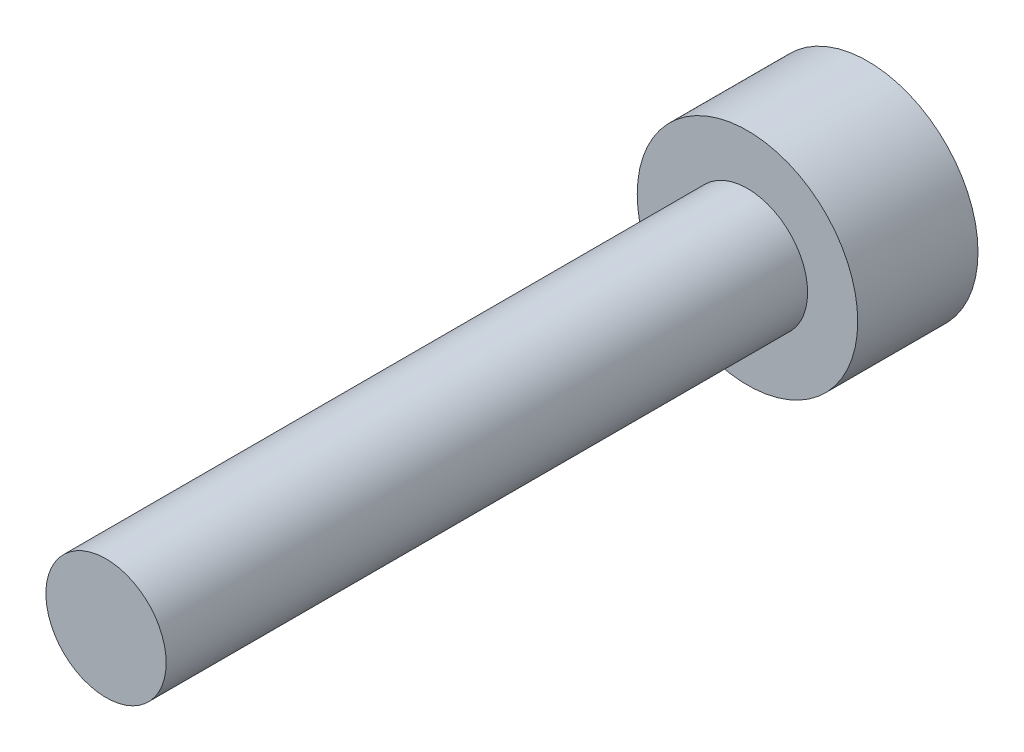
ISO-10303-21;
HEADER;
FILE_DESCRIPTION(('STEP AP214'),'2;1');
FILE_NAME('part.step','',(''),(''),'','','');
FILE_SCHEMA(('AUTOMOTIVE_DESIGN { 1 0 10303 214 1 1 1 1 }'));
ENDSEC;
DATA;
#1=APPLICATION_CONTEXT('core data for automotive mechanical design processes');
#2=APPLICATION_PROTOCOL_DEFINITION('international standard','automotive_design',2000,#1);
#3=PRODUCT_CONTEXT('',#1,'mechanical');
#4=PRODUCT('Part','Part','',(#3));
#5=PRODUCT_RELATED_PRODUCT_CATEGORY('part','',(#4));
#6=PRODUCT_DEFINITION_FORMATION('','',#4);
#7=PRODUCT_DEFINITION_CONTEXT('part definition',#1,'design');
#8=PRODUCT_DEFINITION('design','',#6,#7);
#9=PRODUCT_DEFINITION_SHAPE('','',#8);
#10=(LENGTH_UNIT() NAMED_UNIT(*) SI_UNIT(.MILLI.,.METRE.));
#11=(NAMED_UNIT(*) PLANE_ANGLE_UNIT() SI_UNIT($,.RADIAN.));
#12=(NAMED_UNIT(*) SI_UNIT($,.STERADIAN.) SOLID_ANGLE_UNIT());
#13=UNCERTAINTY_MEASURE_WITH_UNIT(LENGTH_MEASURE(1.E-05),#10,'distance_accuracy_value','');
#14=(GEOMETRIC_REPRESENTATION_CONTEXT(3) GLOBAL_UNCERTAINTY_ASSIGNED_CONTEXT((#13)) GLOBAL_UNIT_ASSIGNED_CONTEXT((#10,
#11,#12)) REPRESENTATION_CONTEXT('',''));
#15=CARTESIAN_POINT('',(0.,0.,0.));
#16=DIRECTION('',(0.,0.,1.));
#17=DIRECTION('',(1.,0.,0.));
#18=AXIS2_PLACEMENT_3D('',#15,#16,#17);
#19=CARTESIAN_POINT('',(0.,0.,-3.));
#20=DIRECTION('',(0.,0.,1.));
#21=DIRECTION('',(1.,0.,0.));
#22=AXIS2_PLACEMENT_3D('',#19,#20,#21);
#23=PLANE('',#22);
#24=CARTESIAN_POINT('',(0.,0.,-3.));
#25=DIRECTION('',(0.,0.,1.));
#26=DIRECTION('',(1.,0.,0.));
#27=AXIS2_PLACEMENT_3D('',#24,#25,#26);
#28=CIRCLE('',#27,2.75);
#29=CARTESIAN_POINT('',(2.75,0.,-3.));
#30=VERTEX_POINT('',#29);
#31=EDGE_CURVE('E47',#30,#30,#28,.T.);
#32=ORIENTED_EDGE('',*,*,#31,.F.);
#33=EDGE_LOOP('',(#32));
#34=FACE_BOUND('',#33,.T.);
#35=DIRECTION('',(0.5,0.866025403784439,0.));
#36=VECTOR('',#35,1.);
#37=CARTESIAN_POINT('',(0.721687836487032,-1.25,-3.));
#38=LINE('',#37,#36);
#39=CARTESIAN_POINT('',(0.721687836487032,-1.25,-3.));
#40=VERTEX_POINT('',#39);
#41=CARTESIAN_POINT('',(1.44337567297406,0.,-3.));
#42=VERTEX_POINT('',#41);
#43=EDGE_CURVE('E62',#40,#42,#38,.T.);
#44=ORIENTED_EDGE('',*,*,#43,.T.);
#45=DIRECTION('',(-0.5,0.866025403784439,0.));
#46=VECTOR('',#45,1.);
#47=CARTESIAN_POINT('',(1.44337567297406,0.,-3.));
#48=LINE('',#47,#46);
#49=CARTESIAN_POINT('',(0.721687836487032,1.25,-3.));
#50=VERTEX_POINT('',#49);
#51=EDGE_CURVE('E138',#42,#50,#48,.T.);
#52=ORIENTED_EDGE('',*,*,#51,.T.);
#53=DIRECTION('',(-1.,0.,0.));
#54=VECTOR('',#53,1.);
#55=CARTESIAN_POINT('',(0.721687836487032,1.25,-3.));
#56=LINE('',#55,#54);
#57=CARTESIAN_POINT('',(-0.721687836487032,1.25,-3.));
#58=VERTEX_POINT('',#57);
#59=EDGE_CURVE('E141',#50,#58,#56,.T.);
#60=ORIENTED_EDGE('',*,*,#59,.T.);
#61=DIRECTION('',(-0.5,-0.866025403784439,0.));
#62=VECTOR('',#61,1.);
#63=CARTESIAN_POINT('',(-0.721687836487032,1.25,-3.));
#64=LINE('',#63,#62);
#65=CARTESIAN_POINT('',(-1.44337567297406,0.,-3.));
#66=VERTEX_POINT('',#65);
#67=EDGE_CURVE('E150',#58,#66,#64,.T.);
#68=ORIENTED_EDGE('',*,*,#67,.T.);
#69=DIRECTION('',(0.5,-0.866025403784439,0.));
#70=VECTOR('',#69,1.);
#71=CARTESIAN_POINT('',(-1.44337567297406,0.,-3.));
#72=LINE('',#71,#70);
#73=CARTESIAN_POINT('',(-0.721687836487033,-1.25,-3.));
#74=VERTEX_POINT('',#73);
#75=EDGE_CURVE('E125',#66,#74,#72,.T.);
#76=ORIENTED_EDGE('',*,*,#75,.T.);
#77=DIRECTION('',(1.,0.,0.));
#78=VECTOR('',#77,1.);
#79=CARTESIAN_POINT('',(-0.721687836487033,-1.25,-3.));
#80=LINE('',#79,#78);
#81=EDGE_CURVE('E155',#74,#40,#80,.T.);
#82=ORIENTED_EDGE('',*,*,#81,.T.);
#83=EDGE_LOOP('',(#44,#52,#60,#68,#76,#82));
#84=FACE_BOUND('',#83,.T.);
#85=ADVANCED_FACE('F44',(#34,#84),#23,.F.);
#86=CARTESIAN_POINT('',(0.,0.,0.));
#87=DIRECTION('',(0.,0.,-1.));
#88=DIRECTION('',(-1.,0.,0.));
#89=AXIS2_PLACEMENT_3D('',#86,#87,#88);
#90=CYLINDRICAL_SURFACE('',#89,2.75);
#91=CARTESIAN_POINT('',(0.,0.,0.));
#92=DIRECTION('',(0.,0.,1.));
#93=DIRECTION('',(1.,0.,0.));
#94=AXIS2_PLACEMENT_3D('',#91,#92,#93);
#95=CIRCLE('',#94,2.75);
#96=CARTESIAN_POINT('',(2.75,0.,0.));
#97=VERTEX_POINT('',#96);
#98=EDGE_CURVE('E54',#97,#97,#95,.T.);
#99=ORIENTED_EDGE('',*,*,#98,.F.);
#100=EDGE_LOOP('',(#99));
#101=FACE_BOUND('',#100,.T.);
#102=ORIENTED_EDGE('',*,*,#31,.T.);
#103=EDGE_LOOP('',(#102));
#104=FACE_BOUND('',#103,.T.);
#105=ADVANCED_FACE('F50',(#101,#104),#90,.T.);
#106=CARTESIAN_POINT('',(0.,0.,0.));
#107=DIRECTION('',(0.,0.,1.));
#108=DIRECTION('',(1.,0.,0.));
#109=AXIS2_PLACEMENT_3D('',#106,#107,#108);
#110=PLANE('',#109);
#111=CARTESIAN_POINT('',(0.,0.,0.));
#112=DIRECTION('',(0.,0.,1.));
#113=DIRECTION('',(1.,0.,0.));
#114=AXIS2_PLACEMENT_3D('',#111,#112,#113);
#115=CIRCLE('',#114,1.5);
#116=CARTESIAN_POINT('',(1.5,0.,0.));
#117=VERTEX_POINT('',#116);
#118=EDGE_CURVE('E11',#117,#117,#115,.T.);
#119=ORIENTED_EDGE('',*,*,#118,.F.);
#120=EDGE_LOOP('',(#119));
#121=FACE_BOUND('',#120,.T.);
#122=ORIENTED_EDGE('',*,*,#98,.T.);
#123=EDGE_LOOP('',(#122));
#124=FACE_BOUND('',#123,.T.);
#125=ADVANCED_FACE('F212',(#121,#124),#110,.T.);
#126=CARTESIAN_POINT('',(0.,0.,16.));
#127=DIRECTION('',(0.,0.,-1.));
#128=DIRECTION('',(-1.,0.,0.));
#129=AXIS2_PLACEMENT_3D('',#126,#127,#128);
#130=CYLINDRICAL_SURFACE('',#129,1.5);
#131=CARTESIAN_POINT('',(0.,0.,16.));
#132=DIRECTION('',(0.,0.,1.));
#133=DIRECTION('',(1.,0.,0.));
#134=AXIS2_PLACEMENT_3D('',#131,#132,#133);
#135=CIRCLE('',#134,1.5);
#136=CARTESIAN_POINT('',(1.5,0.,16.));
#137=VERTEX_POINT('',#136);
#138=EDGE_CURVE('E166',#137,#137,#135,.T.);
#139=ORIENTED_EDGE('',*,*,#138,.F.);
#140=EDGE_LOOP('',(#139));
#141=FACE_BOUND('',#140,.T.);
#142=ORIENTED_EDGE('',*,*,#118,.T.);
#143=EDGE_LOOP('',(#142));
#144=FACE_BOUND('',#143,.T.);
#145=ADVANCED_FACE('F209',(#141,#144),#130,.T.);
#146=CARTESIAN_POINT('',(0.,0.,16.));
#147=DIRECTION('',(0.,0.,1.));
#148=DIRECTION('',(1.,0.,0.));
#149=AXIS2_PLACEMENT_3D('',#146,#147,#148);
#150=PLANE('',#149);
#151=ORIENTED_EDGE('',*,*,#138,.T.);
#152=EDGE_LOOP('',(#151));
#153=FACE_BOUND('',#152,.T.);
#154=ADVANCED_FACE('F204',(#153),#150,.T.);
#155=CARTESIAN_POINT('',(0.721687836487032,-1.25,-1.7));
#156=DIRECTION('',(-0.866025403784439,0.5,0.));
#157=DIRECTION('',(-0.5,-0.866025403784439,0.));
#158=AXIS2_PLACEMENT_3D('',#155,#156,#157);
#159=PLANE('',#158);
#160=ORIENTED_EDGE('',*,*,#43,.F.);
#161=DIRECTION('',(0.,0.,-1.));
#162=VECTOR('',#161,1.);
#163=CARTESIAN_POINT('',(0.721687836487032,-1.25,-1.7));
#164=LINE('',#163,#162);
#165=CARTESIAN_POINT('',(0.721687836487032,-1.25,-1.7));
#166=VERTEX_POINT('',#165);
#167=EDGE_CURVE('E132',#166,#40,#164,.T.);
#168=ORIENTED_EDGE('',*,*,#167,.F.);
#169=DIRECTION('',(0.5,0.866025403784439,0.));
#170=VECTOR('',#169,1.);
#171=CARTESIAN_POINT('',(0.721687836487032,-1.25,-1.7));
#172=LINE('',#171,#170);
#173=CARTESIAN_POINT('',(1.44337567297406,0.,-1.7));
#174=VERTEX_POINT('',#173);
#175=EDGE_CURVE('E156',#166,#174,#172,.T.);
#176=ORIENTED_EDGE('',*,*,#175,.T.);
#177=DIRECTION('',(0.,0.,-1.));
#178=VECTOR('',#177,1.);
#179=CARTESIAN_POINT('',(1.44337567297406,0.,-1.7));
#180=LINE('',#179,#178);
#181=EDGE_CURVE('E167',#174,#42,#180,.T.);
#182=ORIENTED_EDGE('',*,*,#181,.T.);
#183=EDGE_LOOP('',(#160,#168,#176,#182));
#184=FACE_BOUND('',#183,.T.);
#185=ADVANCED_FACE('F184',(#184),#159,.T.);
#186=CARTESIAN_POINT('',(1.44337567297406,0.,-1.7));
#187=DIRECTION('',(-0.866025403784439,-0.5,0.));
#188=DIRECTION('',(0.5,-0.866025403784439,0.));
#189=AXIS2_PLACEMENT_3D('',#186,#187,#188);
#190=PLANE('',#189);
#191=ORIENTED_EDGE('',*,*,#51,.F.);
#192=ORIENTED_EDGE('',*,*,#181,.F.);
#193=DIRECTION('',(-0.5,0.866025403784439,0.));
#194=VECTOR('',#193,1.);
#195=CARTESIAN_POINT('',(1.44337567297406,0.,-1.7));
#196=LINE('',#195,#194);
#197=CARTESIAN_POINT('',(0.721687836487032,1.25,-1.7));
#198=VERTEX_POINT('',#197);
#199=EDGE_CURVE('E105',#174,#198,#196,.T.);
#200=ORIENTED_EDGE('',*,*,#199,.T.);
#201=DIRECTION('',(0.,0.,-1.));
#202=VECTOR('',#201,1.);
#203=CARTESIAN_POINT('',(0.721687836487032,1.25,-1.7));
#204=LINE('',#203,#202);
#205=EDGE_CURVE('E162',#198,#50,#204,.T.);
#206=ORIENTED_EDGE('',*,*,#205,.T.);
#207=EDGE_LOOP('',(#191,#192,#200,#206));
#208=FACE_BOUND('',#207,.T.);
#209=ADVANCED_FACE('F198',(#208),#190,.T.);
#210=CARTESIAN_POINT('',(0.721687836487032,1.25,-1.7));
#211=DIRECTION('',(0.,-1.,0.));
#212=DIRECTION('',(1.,0.,0.));
#213=AXIS2_PLACEMENT_3D('',#210,#211,#212);
#214=PLANE('',#213);
#215=ORIENTED_EDGE('',*,*,#59,.F.);
#216=ORIENTED_EDGE('',*,*,#205,.F.);
#217=DIRECTION('',(-1.,0.,0.));
#218=VECTOR('',#217,1.);
#219=CARTESIAN_POINT('',(0.721687836487032,1.25,-1.7));
#220=LINE('',#219,#218);
#221=CARTESIAN_POINT('',(-0.721687836487032,1.25,-1.7));
#222=VERTEX_POINT('',#221);
#223=EDGE_CURVE('E121',#198,#222,#220,.T.);
#224=ORIENTED_EDGE('',*,*,#223,.T.);
#225=DIRECTION('',(0.,0.,-1.));
#226=VECTOR('',#225,1.);
#227=CARTESIAN_POINT('',(-0.721687836487032,1.25,-1.7));
#228=LINE('',#227,#226);
#229=EDGE_CURVE('E119',#222,#58,#228,.T.);
#230=ORIENTED_EDGE('',*,*,#229,.T.);
#231=EDGE_LOOP('',(#215,#216,#224,#230));
#232=FACE_BOUND('',#231,.T.);
#233=ADVANCED_FACE('F193',(#232),#214,.T.);
#234=CARTESIAN_POINT('',(-0.721687836487032,1.25,-1.7));
#235=DIRECTION('',(0.866025403784439,-0.5,0.));
#236=DIRECTION('',(0.5,0.866025403784439,0.));
#237=AXIS2_PLACEMENT_3D('',#234,#235,#236);
#238=PLANE('',#237);
#239=ORIENTED_EDGE('',*,*,#67,.F.);
#240=ORIENTED_EDGE('',*,*,#229,.F.);
#241=DIRECTION('',(-0.5,-0.866025403784439,0.));
#242=VECTOR('',#241,1.);
#243=CARTESIAN_POINT('',(-0.721687836487032,1.25,-1.7));
#244=LINE('',#243,#242);
#245=CARTESIAN_POINT('',(-1.44337567297406,0.,-1.7));
#246=VERTEX_POINT('',#245);
#247=EDGE_CURVE('E115',#222,#246,#244,.T.);
#248=ORIENTED_EDGE('',*,*,#247,.T.);
#249=DIRECTION('',(0.,0.,-1.));
#250=VECTOR('',#249,1.);
#251=CARTESIAN_POINT('',(-1.44337567297406,0.,-1.7));
#252=LINE('',#251,#250);
#253=EDGE_CURVE('E118',#246,#66,#252,.T.);
#254=ORIENTED_EDGE('',*,*,#253,.T.);
#255=EDGE_LOOP('',(#239,#240,#248,#254));
#256=FACE_BOUND('',#255,.T.);
#257=ADVANCED_FACE('F113',(#256),#238,.T.);
#258=CARTESIAN_POINT('',(-1.44337567297406,0.,-1.7));
#259=DIRECTION('',(0.866025403784439,0.5,0.));
#260=DIRECTION('',(-0.5,0.866025403784439,0.));
#261=AXIS2_PLACEMENT_3D('',#258,#259,#260);
#262=PLANE('',#261);
#263=ORIENTED_EDGE('',*,*,#75,.F.);
#264=ORIENTED_EDGE('',*,*,#253,.F.);
#265=DIRECTION('',(0.5,-0.866025403784439,0.));
#266=VECTOR('',#265,1.);
#267=CARTESIAN_POINT('',(-1.44337567297406,0.,-1.7));
#268=LINE('',#267,#266);
#269=CARTESIAN_POINT('',(-0.721687836487033,-1.25,-1.7));
#270=VERTEX_POINT('',#269);
#271=EDGE_CURVE('E116',#246,#270,#268,.T.);
#272=ORIENTED_EDGE('',*,*,#271,.T.);
#273=DIRECTION('',(0.,0.,-1.));
#274=VECTOR('',#273,1.);
#275=CARTESIAN_POINT('',(-0.721687836487033,-1.25,-1.7));
#276=LINE('',#275,#274);
#277=EDGE_CURVE('E91',#270,#74,#276,.T.);
#278=ORIENTED_EDGE('',*,*,#277,.T.);
#279=EDGE_LOOP('',(#263,#264,#272,#278));
#280=FACE_BOUND('',#279,.T.);
#281=ADVANCED_FACE('F124',(#280),#262,.T.);
#282=CARTESIAN_POINT('',(-0.721687836487033,-1.25,-1.7));
#283=DIRECTION('',(0.,1.,0.));
#284=DIRECTION('',(-1.,0.,0.));
#285=AXIS2_PLACEMENT_3D('',#282,#283,#284);
#286=PLANE('',#285);
#287=ORIENTED_EDGE('',*,*,#81,.F.);
#288=ORIENTED_EDGE('',*,*,#277,.F.);
#289=DIRECTION('',(1.,0.,0.));
#290=VECTOR('',#289,1.);
#291=CARTESIAN_POINT('',(-0.721687836487033,-1.25,-1.7));
#292=LINE('',#291,#290);
#293=EDGE_CURVE('E72',#270,#166,#292,.T.);
#294=ORIENTED_EDGE('',*,*,#293,.T.);
#295=ORIENTED_EDGE('',*,*,#167,.T.);
#296=EDGE_LOOP('',(#287,#288,#294,#295));
#297=FACE_BOUND('',#296,.T.);
#298=ADVANCED_FACE('F181',(#297),#286,.T.);
#299=CARTESIAN_POINT('',(0.,0.,-1.7));
#300=DIRECTION('',(0.,0.,1.));
#301=DIRECTION('',(1.,0.,0.));
#302=AXIS2_PLACEMENT_3D('',#299,#300,#301);
#303=PLANE('',#302);
#304=ORIENTED_EDGE('',*,*,#175,.F.);
#305=ORIENTED_EDGE('',*,*,#293,.F.);
#306=ORIENTED_EDGE('',*,*,#271,.F.);
#307=ORIENTED_EDGE('',*,*,#247,.F.);
#308=ORIENTED_EDGE('',*,*,#223,.F.);
#309=ORIENTED_EDGE('',*,*,#199,.F.);
#310=EDGE_LOOP('',(#304,#305,#306,#307,#308,#309));
#311=FACE_BOUND('',#310,.T.);
#312=ADVANCED_FACE('F129',(#311),#303,.F.);
#313=CLOSED_SHELL('',(#85,#105,#125,#145,#154,#185,#209,#233,#257,#281,#298,#312));
#314=MANIFOLD_SOLID_BREP('B2',#313);
#315=ADVANCED_BREP_SHAPE_REPRESENTATION('',(#18,#314),#14);
#316=SHAPE_DEFINITION_REPRESENTATION(#9,#315);
ENDSEC;
END-ISO-10303-21;
